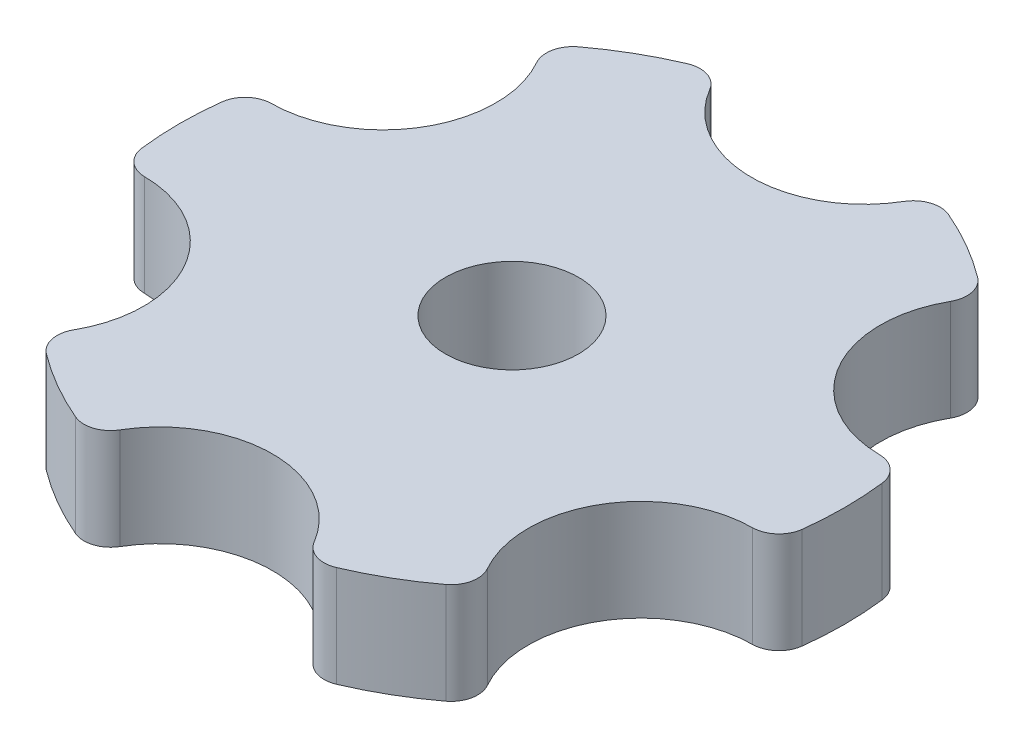
ISO-10303-21;
HEADER;
FILE_DESCRIPTION(('STEP AP214'),'2;1');
FILE_NAME('part.step','',(''),(''),'','','');
FILE_SCHEMA(('AUTOMOTIVE_DESIGN { 1 0 10303 214 1 1 1 1 }'));
ENDSEC;
DATA;
#1=APPLICATION_CONTEXT('core data for automotive mechanical design processes');
#2=APPLICATION_PROTOCOL_DEFINITION('international standard','automotive_design',2000,#1);
#3=PRODUCT_CONTEXT('',#1,'mechanical');
#4=PRODUCT('Part','Part','',(#3));
#5=PRODUCT_RELATED_PRODUCT_CATEGORY('part','',(#4));
#6=PRODUCT_DEFINITION_FORMATION('','',#4);
#7=PRODUCT_DEFINITION_CONTEXT('part definition',#1,'design');
#8=PRODUCT_DEFINITION('design','',#6,#7);
#9=PRODUCT_DEFINITION_SHAPE('','',#8);
#10=(LENGTH_UNIT() NAMED_UNIT(*) SI_UNIT(.MILLI.,.METRE.));
#11=(NAMED_UNIT(*) PLANE_ANGLE_UNIT() SI_UNIT($,.RADIAN.));
#12=(NAMED_UNIT(*) SI_UNIT($,.STERADIAN.) SOLID_ANGLE_UNIT());
#13=UNCERTAINTY_MEASURE_WITH_UNIT(LENGTH_MEASURE(1.E-05),#10,'distance_accuracy_value','');
#14=(GEOMETRIC_REPRESENTATION_CONTEXT(3) GLOBAL_UNCERTAINTY_ASSIGNED_CONTEXT((#13)) GLOBAL_UNIT_ASSIGNED_CONTEXT((#10,
#11,#12)) REPRESENTATION_CONTEXT('',''));
#15=CARTESIAN_POINT('',(0.,0.,0.));
#16=DIRECTION('',(0.,0.,1.));
#17=DIRECTION('',(1.,0.,0.));
#18=AXIS2_PLACEMENT_3D('',#15,#16,#17);
#19=CARTESIAN_POINT('',(0.,9.652,-16.809169409399));
#20=DIRECTION('',(0.,-1.,0.));
#21=DIRECTION('',(0.,0.,-1.));
#22=AXIS2_PLACEMENT_3D('',#19,#20,#21);
#23=PLANE('',#22);
#24=CARTESIAN_POINT('',(0.,9.652,0.));
#25=DIRECTION('',(0.,1.,0.));
#26=DIRECTION('',(0.,0.,-1.));
#27=AXIS2_PLACEMENT_3D('',#24,#25,#26);
#28=CIRCLE('',#27,31.75);
#29=CARTESIAN_POINT('',(12.4545474107137,9.652,29.2052520755135));
#30=VERTEX_POINT('',#29);
#31=CARTESIAN_POINT('',(19.065216515966,9.652,25.3885804880725));
#32=VERTEX_POINT('',#31);
#33=EDGE_CURVE('E445',#30,#32,#28,.T.);
#34=ORIENTED_EDGE('',*,*,#33,.T.);
#35=CARTESIAN_POINT('',(17.5399991946888,9.652,23.3574940490267));
#36=DIRECTION('',(0.,-1.,0.));
#37=DIRECTION('',(0.,0.,-1.));
#38=AXIS2_PLACEMENT_3D('',#35,#36,#37);
#39=CIRCLE('',#38,2.54);
#40=CARTESIAN_POINT('',(19.75071246417,9.652,22.1067555311343));
#41=VERTEX_POINT('',#40);
#42=EDGE_CURVE('E329',#32,#41,#39,.F.);
#43=ORIENTED_EDGE('',*,*,#42,.T.);
#44=CARTESIAN_POINT('',(29.1143354501117,9.652,16.809169409399));
#45=DIRECTION('',(0.,-1.,0.));
#46=DIRECTION('',(0.,0.,1.));
#47=AXIS2_PLACEMENT_3D('',#44,#45,#46);
#48=CIRCLE('',#47,10.7583388187981);
#49=CARTESIAN_POINT('',(29.0203681172995,9.652,6.05124097124599));
#50=VERTEX_POINT('',#49);
#51=EDGE_CURVE('E226',#41,#50,#48,.T.);
#52=ORIENTED_EDGE('',*,*,#51,.T.);
#53=CARTESIAN_POINT('',(28.9981828125453,9.652,3.51133786044571));
#54=DIRECTION('',(0.,-1.,0.));
#55=DIRECTION('',(0.,0.,-1.));
#56=AXIS2_PLACEMENT_3D('',#53,#54,#55);
#57=CIRCLE('',#56,2.54);
#58=CARTESIAN_POINT('',(31.5197639266797,9.652,3.81667158744099));
#59=VERTEX_POINT('',#58);
#60=EDGE_CURVE('E326',#50,#59,#57,.F.);
#61=ORIENTED_EDGE('',*,*,#60,.T.);
#62=CARTESIAN_POINT('',(0.,9.652,0.));
#63=DIRECTION('',(0.,1.,0.));
#64=DIRECTION('',(0.,0.,-1.));
#65=AXIS2_PLACEMENT_3D('',#62,#63,#64);
#66=CIRCLE('',#65,31.75);
#67=CARTESIAN_POINT('',(31.5197639266797,9.652,-3.81667158744092));
#68=VERTEX_POINT('',#67);
#69=EDGE_CURVE('E439',#59,#68,#66,.T.);
#70=ORIENTED_EDGE('',*,*,#69,.T.);
#71=CARTESIAN_POINT('',(28.9981828125454,9.652,-3.51133786044565));
#72=DIRECTION('',(0.,-1.,0.));
#73=DIRECTION('',(0.,0.,-1.));
#74=AXIS2_PLACEMENT_3D('',#71,#72,#73);
#75=CIRCLE('',#74,2.54);
#76=CARTESIAN_POINT('',(29.0203681172995,9.652,-6.05124097124593));
#77=VERTEX_POINT('',#76);
#78=EDGE_CURVE('E323',#68,#77,#75,.F.);
#79=ORIENTED_EDGE('',*,*,#78,.T.);
#80=CARTESIAN_POINT('',(29.1143354501117,9.652,-16.809169409399));
#81=DIRECTION('',(0.,-1.,0.));
#82=DIRECTION('',(0.,0.,1.));
#83=AXIS2_PLACEMENT_3D('',#80,#81,#82);
#84=CIRCLE('',#83,10.7583388187981);
#85=CARTESIAN_POINT('',(19.75071246417,9.652,-22.1067555311343));
#86=VERTEX_POINT('',#85);
#87=EDGE_CURVE('E435',#77,#86,#84,.T.);
#88=ORIENTED_EDGE('',*,*,#87,.T.);
#89=CARTESIAN_POINT('',(17.5399991946888,9.652,-23.3574940490267));
#90=DIRECTION('',(0.,-1.,0.));
#91=DIRECTION('',(0.,0.,-1.));
#92=AXIS2_PLACEMENT_3D('',#89,#90,#91);
#93=CIRCLE('',#92,2.54);
#94=CARTESIAN_POINT('',(19.0652165159661,9.652,-25.3885804880725));
#95=VERTEX_POINT('',#94);
#96=EDGE_CURVE('E320',#86,#95,#93,.F.);
#97=ORIENTED_EDGE('',*,*,#96,.T.);
#98=CARTESIAN_POINT('',(0.,9.652,0.));
#99=DIRECTION('',(0.,1.,0.));
#100=DIRECTION('',(0.,0.,-1.));
#101=AXIS2_PLACEMENT_3D('',#98,#99,#100);
#102=CIRCLE('',#101,31.75);
#103=CARTESIAN_POINT('',(12.4545474107137,9.652,-29.2052520755135));
#104=VERTEX_POINT('',#103);
#105=EDGE_CURVE('E432',#95,#104,#102,.T.);
#106=ORIENTED_EDGE('',*,*,#105,.T.);
#107=CARTESIAN_POINT('',(11.4581836178566,9.652,-26.8688319094724));
#108=DIRECTION('',(0.,-1.,0.));
#109=DIRECTION('',(0.,0.,-1.));
#110=AXIS2_PLACEMENT_3D('',#107,#108,#109);
#111=CIRCLE('',#110,2.54);
#112=CARTESIAN_POINT('',(9.26965565312948,9.652,-28.1579965023803));
#113=VERTEX_POINT('',#112);
#114=EDGE_CURVE('E65',#104,#113,#111,.F.);
#115=ORIENTED_EDGE('',*,*,#114,.T.);
#116=CARTESIAN_POINT('',(0.,9.652,-33.6183388187981));
#117=DIRECTION('',(0.,-1.,0.));
#118=DIRECTION('',(0.,0.,1.));
#119=AXIS2_PLACEMENT_3D('',#116,#117,#118);
#120=CIRCLE('',#119,10.7583388187981);
#121=CARTESIAN_POINT('',(-9.26965565312947,9.652,-28.1579965023803));
#122=VERTEX_POINT('',#121);
#123=EDGE_CURVE('E259',#113,#122,#120,.T.);
#124=ORIENTED_EDGE('',*,*,#123,.T.);
#125=CARTESIAN_POINT('',(-11.4581836178566,9.652,-26.8688319094724));
#126=DIRECTION('',(0.,-1.,0.));
#127=DIRECTION('',(0.,0.,-1.));
#128=AXIS2_PLACEMENT_3D('',#125,#126,#127);
#129=CIRCLE('',#128,2.54);
#130=CARTESIAN_POINT('',(-12.4545474107137,9.652,-29.2052520755135));
#131=VERTEX_POINT('',#130);
#132=EDGE_CURVE('E315',#122,#131,#129,.F.);
#133=ORIENTED_EDGE('',*,*,#132,.T.);
#134=CARTESIAN_POINT('',(0.,9.652,0.));
#135=DIRECTION('',(0.,1.,0.));
#136=DIRECTION('',(0.,0.,-1.));
#137=AXIS2_PLACEMENT_3D('',#134,#135,#136);
#138=CIRCLE('',#137,31.75);
#139=CARTESIAN_POINT('',(-19.0652165159657,9.652,-25.3885804880728));
#140=VERTEX_POINT('',#139);
#141=EDGE_CURVE('E257',#131,#140,#138,.T.);
#142=ORIENTED_EDGE('',*,*,#141,.T.);
#143=CARTESIAN_POINT('',(-17.5399991946884,9.652,-23.3574940490269));
#144=DIRECTION('',(0.,-1.,0.));
#145=DIRECTION('',(0.,0.,-1.));
#146=AXIS2_PLACEMENT_3D('',#143,#144,#145);
#147=CIRCLE('',#146,2.54);
#148=CARTESIAN_POINT('',(-19.7507124641696,9.652,-22.1067555311344));
#149=VERTEX_POINT('',#148);
#150=EDGE_CURVE('E312',#140,#149,#147,.F.);
#151=ORIENTED_EDGE('',*,*,#150,.T.);
#152=CARTESIAN_POINT('',(-29.114335450111,9.652,-16.8091694093984));
#153=DIRECTION('',(0.,-1.,0.));
#154=DIRECTION('',(0.,0.,1.));
#155=AXIS2_PLACEMENT_3D('',#152,#153,#154);
#156=CIRCLE('',#155,10.7583388187982);
#157=CARTESIAN_POINT('',(-29.0203681172991,9.652,-6.05124097124524));
#158=VERTEX_POINT('',#157);
#159=EDGE_CURVE('E463',#149,#158,#156,.T.);
#160=ORIENTED_EDGE('',*,*,#159,.T.);
#161=CARTESIAN_POINT('',(-28.9981828125451,9.652,-3.51133786044495));
#162=DIRECTION('',(0.,-1.,0.));
#163=DIRECTION('',(0.,0.,-1.));
#164=AXIS2_PLACEMENT_3D('',#161,#162,#163);
#165=CIRCLE('',#164,2.54);
#166=CARTESIAN_POINT('',(-31.5197639266794,9.652,-3.81667158744017));
#167=VERTEX_POINT('',#166);
#168=EDGE_CURVE('E309',#158,#167,#165,.F.);
#169=ORIENTED_EDGE('',*,*,#168,.T.);
#170=CARTESIAN_POINT('',(0.,9.652,0.));
#171=DIRECTION('',(0.,1.,0.));
#172=DIRECTION('',(0.,0.,-1.));
#173=AXIS2_PLACEMENT_3D('',#170,#171,#172);
#174=CIRCLE('',#173,31.7499999999996);
#175=CARTESIAN_POINT('',(-31.5197639266793,9.652,3.81667158744101));
#176=VERTEX_POINT('',#175);
#177=EDGE_CURVE('E459',#167,#176,#174,.T.);
#178=ORIENTED_EDGE('',*,*,#177,.T.);
#179=CARTESIAN_POINT('',(-28.998182812545,9.652,3.51133786044573));
#180=DIRECTION('',(0.,-1.,0.));
#181=DIRECTION('',(0.,0.,-1.));
#182=AXIS2_PLACEMENT_3D('',#179,#180,#181);
#183=CIRCLE('',#182,2.54);
#184=CARTESIAN_POINT('',(-29.0203681172991,9.652,6.05124097124601));
#185=VERTEX_POINT('',#184);
#186=EDGE_CURVE('E306',#176,#185,#183,.F.);
#187=ORIENTED_EDGE('',*,*,#186,.T.);
#188=CARTESIAN_POINT('',(-29.1143354501117,9.652,16.8091694093991));
#189=DIRECTION('',(0.,-1.,0.));
#190=DIRECTION('',(0.,0.,1.));
#191=AXIS2_PLACEMENT_3D('',#188,#189,#190);
#192=CIRCLE('',#191,10.7583388187981);
#193=CARTESIAN_POINT('',(-19.75071246417,9.652,22.1067555311343));
#194=VERTEX_POINT('',#193);
#195=EDGE_CURVE('E455',#185,#194,#192,.T.);
#196=ORIENTED_EDGE('',*,*,#195,.T.);
#197=CARTESIAN_POINT('',(-17.5399991946887,9.652,23.3574940490267));
#198=DIRECTION('',(0.,-1.,0.));
#199=DIRECTION('',(0.,0.,-1.));
#200=AXIS2_PLACEMENT_3D('',#197,#198,#199);
#201=CIRCLE('',#200,2.54);
#202=CARTESIAN_POINT('',(-19.065216515966,9.652,25.3885804880725));
#203=VERTEX_POINT('',#202);
#204=EDGE_CURVE('E303',#194,#203,#201,.F.);
#205=ORIENTED_EDGE('',*,*,#204,.T.);
#206=CARTESIAN_POINT('',(0.,9.652,0.));
#207=DIRECTION('',(0.,1.,0.));
#208=DIRECTION('',(0.,0.,-1.));
#209=AXIS2_PLACEMENT_3D('',#206,#207,#208);
#210=CIRCLE('',#209,31.75);
#211=CARTESIAN_POINT('',(-12.4545474107137,9.652,29.2052520755135));
#212=VERTEX_POINT('',#211);
#213=EDGE_CURVE('E451',#203,#212,#210,.T.);
#214=ORIENTED_EDGE('',*,*,#213,.T.);
#215=CARTESIAN_POINT('',(-11.4581836178566,9.652,26.8688319094724));
#216=DIRECTION('',(0.,-1.,0.));
#217=DIRECTION('',(0.,0.,-1.));
#218=AXIS2_PLACEMENT_3D('',#215,#216,#217);
#219=CIRCLE('',#218,2.54);
#220=CARTESIAN_POINT('',(-9.26965565312947,9.652,28.1579965023803));
#221=VERTEX_POINT('',#220);
#222=EDGE_CURVE('E297',#212,#221,#219,.F.);
#223=ORIENTED_EDGE('',*,*,#222,.T.);
#224=CARTESIAN_POINT('',(0.,9.652,33.6183388187981));
#225=DIRECTION('',(0.,-1.,0.));
#226=DIRECTION('',(0.,0.,1.));
#227=AXIS2_PLACEMENT_3D('',#224,#225,#226);
#228=CIRCLE('',#227,10.7583388187981);
#229=CARTESIAN_POINT('',(9.26965565312948,9.652,28.1579965023803));
#230=VERTEX_POINT('',#229);
#231=EDGE_CURVE('E403',#221,#230,#228,.T.);
#232=ORIENTED_EDGE('',*,*,#231,.T.);
#233=CARTESIAN_POINT('',(11.4581836178566,9.652,26.8688319094724));
#234=DIRECTION('',(0.,-1.,0.));
#235=DIRECTION('',(0.,0.,-1.));
#236=AXIS2_PLACEMENT_3D('',#233,#234,#235);
#237=CIRCLE('',#236,2.54);
#238=EDGE_CURVE('E300',#230,#30,#237,.F.);
#239=ORIENTED_EDGE('',*,*,#238,.T.);
#240=EDGE_LOOP('',(#34,#43,#52,#61,#70,#79,#88,#97,#106,#115,#124,#133,#142,#151,#160,#169,#178,
#187,#196,#205,#214,#223,#232,#239));
#241=FACE_BOUND('',#240,.T.);
#242=CARTESIAN_POINT('',(0.,9.652,0.));
#243=DIRECTION('',(0.,1.,0.));
#244=DIRECTION('',(0.,0.,1.));
#245=AXIS2_PLACEMENT_3D('',#242,#243,#244);
#246=CIRCLE('',#245,6.35);
#247=CARTESIAN_POINT('',(0.,9.652,6.35));
#248=VERTEX_POINT('',#247);
#249=EDGE_CURVE('E429',#248,#248,#246,.T.);
#250=ORIENTED_EDGE('',*,*,#249,.F.);
#251=EDGE_LOOP('',(#250));
#252=FACE_BOUND('',#251,.T.);
#253=ADVANCED_FACE('F42',(#241,#252),#23,.F.);
#254=CARTESIAN_POINT('',(0.,0.,-16.809169409399));
#255=DIRECTION('',(0.,-1.,0.));
#256=DIRECTION('',(0.,0.,-1.));
#257=AXIS2_PLACEMENT_3D('',#254,#255,#256);
#258=PLANE('',#257);
#259=CARTESIAN_POINT('',(29.1143354501117,0.,16.809169409399));
#260=DIRECTION('',(0.,-1.,0.));
#261=DIRECTION('',(0.,0.,1.));
#262=AXIS2_PLACEMENT_3D('',#259,#260,#261);
#263=CIRCLE('',#262,10.7583388187981);
#264=CARTESIAN_POINT('',(19.75071246417,0.,22.1067555311343));
#265=VERTEX_POINT('',#264);
#266=CARTESIAN_POINT('',(29.0203681172995,0.,6.05124097124599));
#267=VERTEX_POINT('',#266);
#268=EDGE_CURVE('E223',#265,#267,#263,.T.);
#269=ORIENTED_EDGE('',*,*,#268,.F.);
#270=CARTESIAN_POINT('',(17.5399991946888,0.,23.3574940490267));
#271=DIRECTION('',(0.,-1.,0.));
#272=DIRECTION('',(0.,0.,-1.));
#273=AXIS2_PLACEMENT_3D('',#270,#271,#272);
#274=CIRCLE('',#273,2.54);
#275=CARTESIAN_POINT('',(19.065216515966,0.,25.3885804880725));
#276=VERTEX_POINT('',#275);
#277=EDGE_CURVE('E205',#265,#276,#274,.T.);
#278=ORIENTED_EDGE('',*,*,#277,.T.);
#279=CARTESIAN_POINT('',(0.,0.,0.));
#280=DIRECTION('',(0.,1.,0.));
#281=DIRECTION('',(0.,0.,-1.));
#282=AXIS2_PLACEMENT_3D('',#279,#280,#281);
#283=CIRCLE('',#282,31.75);
#284=CARTESIAN_POINT('',(12.4545474107137,0.,29.2052520755135));
#285=VERTEX_POINT('',#284);
#286=EDGE_CURVE('E236',#285,#276,#283,.T.);
#287=ORIENTED_EDGE('',*,*,#286,.F.);
#288=CARTESIAN_POINT('',(11.4581836178566,0.,26.8688319094724));
#289=DIRECTION('',(0.,-1.,0.));
#290=DIRECTION('',(0.,0.,-1.));
#291=AXIS2_PLACEMENT_3D('',#288,#289,#290);
#292=CIRCLE('',#291,2.54);
#293=CARTESIAN_POINT('',(9.26965565312948,0.,28.1579965023803));
#294=VERTEX_POINT('',#293);
#295=EDGE_CURVE('E263',#285,#294,#292,.T.);
#296=ORIENTED_EDGE('',*,*,#295,.T.);
#297=CARTESIAN_POINT('',(0.,0.,33.6183388187981));
#298=DIRECTION('',(0.,-1.,0.));
#299=DIRECTION('',(0.,0.,1.));
#300=AXIS2_PLACEMENT_3D('',#297,#298,#299);
#301=CIRCLE('',#300,10.7583388187981);
#302=CARTESIAN_POINT('',(-9.26965565312947,0.,28.1579965023803));
#303=VERTEX_POINT('',#302);
#304=EDGE_CURVE('E243',#303,#294,#301,.T.);
#305=ORIENTED_EDGE('',*,*,#304,.F.);
#306=CARTESIAN_POINT('',(-11.4581836178566,0.,26.8688319094724));
#307=DIRECTION('',(0.,-1.,0.));
#308=DIRECTION('',(0.,0.,-1.));
#309=AXIS2_PLACEMENT_3D('',#306,#307,#308);
#310=CIRCLE('',#309,2.54);
#311=CARTESIAN_POINT('',(-12.4545474107137,0.,29.2052520755135));
#312=VERTEX_POINT('',#311);
#313=EDGE_CURVE('E228',#303,#312,#310,.T.);
#314=ORIENTED_EDGE('',*,*,#313,.T.);
#315=CARTESIAN_POINT('',(0.,0.,0.));
#316=DIRECTION('',(0.,1.,0.));
#317=DIRECTION('',(0.,0.,-1.));
#318=AXIS2_PLACEMENT_3D('',#315,#316,#317);
#319=CIRCLE('',#318,31.75);
#320=CARTESIAN_POINT('',(-19.065216515966,0.,25.3885804880725));
#321=VERTEX_POINT('',#320);
#322=EDGE_CURVE('E409',#321,#312,#319,.T.);
#323=ORIENTED_EDGE('',*,*,#322,.F.);
#324=CARTESIAN_POINT('',(-17.5399991946887,0.,23.3574940490267));
#325=DIRECTION('',(0.,-1.,0.));
#326=DIRECTION('',(0.,0.,-1.));
#327=AXIS2_PLACEMENT_3D('',#324,#325,#326);
#328=CIRCLE('',#327,2.54);
#329=CARTESIAN_POINT('',(-19.75071246417,0.,22.1067555311343));
#330=VERTEX_POINT('',#329);
#331=EDGE_CURVE('E266',#321,#330,#328,.T.);
#332=ORIENTED_EDGE('',*,*,#331,.T.);
#333=CARTESIAN_POINT('',(-29.1143354501117,0.,16.8091694093991));
#334=DIRECTION('',(0.,-1.,0.));
#335=DIRECTION('',(0.,0.,1.));
#336=AXIS2_PLACEMENT_3D('',#333,#334,#335);
#337=CIRCLE('',#336,10.7583388187981);
#338=CARTESIAN_POINT('',(-29.0203681172991,0.,6.05124097124601));
#339=VERTEX_POINT('',#338);
#340=EDGE_CURVE('E411',#339,#330,#337,.T.);
#341=ORIENTED_EDGE('',*,*,#340,.F.);
#342=CARTESIAN_POINT('',(-28.998182812545,0.,3.51133786044573));
#343=DIRECTION('',(0.,-1.,0.));
#344=DIRECTION('',(0.,0.,-1.));
#345=AXIS2_PLACEMENT_3D('',#342,#343,#344);
#346=CIRCLE('',#345,2.54);
#347=CARTESIAN_POINT('',(-31.5197639266793,0.,3.81667158744101));
#348=VERTEX_POINT('',#347);
#349=EDGE_CURVE('E269',#339,#348,#346,.T.);
#350=ORIENTED_EDGE('',*,*,#349,.T.);
#351=CARTESIAN_POINT('',(0.,0.,0.));
#352=DIRECTION('',(0.,1.,0.));
#353=DIRECTION('',(0.,0.,-1.));
#354=AXIS2_PLACEMENT_3D('',#351,#352,#353);
#355=CIRCLE('',#354,31.7499999999996);
#356=CARTESIAN_POINT('',(-31.5197639266794,0.,-3.81667158744017));
#357=VERTEX_POINT('',#356);
#358=EDGE_CURVE('E417',#357,#348,#355,.T.);
#359=ORIENTED_EDGE('',*,*,#358,.F.);
#360=CARTESIAN_POINT('',(-28.9981828125451,0.,-3.51133786044495));
#361=DIRECTION('',(0.,-1.,0.));
#362=DIRECTION('',(0.,0.,-1.));
#363=AXIS2_PLACEMENT_3D('',#360,#361,#362);
#364=CIRCLE('',#363,2.54);
#365=CARTESIAN_POINT('',(-29.0203681172991,0.,-6.05124097124524));
#366=VERTEX_POINT('',#365);
#367=EDGE_CURVE('E272',#357,#366,#364,.T.);
#368=ORIENTED_EDGE('',*,*,#367,.T.);
#369=CARTESIAN_POINT('',(-29.114335450111,0.,-16.8091694093984));
#370=DIRECTION('',(0.,-1.,0.));
#371=DIRECTION('',(0.,0.,1.));
#372=AXIS2_PLACEMENT_3D('',#369,#370,#371);
#373=CIRCLE('',#372,10.7583388187982);
#374=CARTESIAN_POINT('',(-19.7507124641696,0.,-22.1067555311344));
#375=VERTEX_POINT('',#374);
#376=EDGE_CURVE('E421',#375,#366,#373,.T.);
#377=ORIENTED_EDGE('',*,*,#376,.F.);
#378=CARTESIAN_POINT('',(-17.5399991946884,0.,-23.3574940490269));
#379=DIRECTION('',(0.,-1.,0.));
#380=DIRECTION('',(0.,0.,-1.));
#381=AXIS2_PLACEMENT_3D('',#378,#379,#380);
#382=CIRCLE('',#381,2.54);
#383=CARTESIAN_POINT('',(-19.0652165159657,0.,-25.3885804880728));
#384=VERTEX_POINT('',#383);
#385=EDGE_CURVE('E275',#375,#384,#382,.T.);
#386=ORIENTED_EDGE('',*,*,#385,.T.);
#387=CARTESIAN_POINT('',(0.,0.,0.));
#388=DIRECTION('',(0.,1.,0.));
#389=DIRECTION('',(0.,0.,-1.));
#390=AXIS2_PLACEMENT_3D('',#387,#388,#389);
#391=CIRCLE('',#390,31.75);
#392=CARTESIAN_POINT('',(-12.4545474107137,0.,-29.2052520755135));
#393=VERTEX_POINT('',#392);
#394=EDGE_CURVE('E425',#393,#384,#391,.T.);
#395=ORIENTED_EDGE('',*,*,#394,.F.);
#396=CARTESIAN_POINT('',(-11.4581836178566,0.,-26.8688319094724));
#397=DIRECTION('',(0.,-1.,0.));
#398=DIRECTION('',(0.,0.,-1.));
#399=AXIS2_PLACEMENT_3D('',#396,#397,#398);
#400=CIRCLE('',#399,2.54);
#401=CARTESIAN_POINT('',(-9.26965565312947,0.,-28.1579965023803));
#402=VERTEX_POINT('',#401);
#403=EDGE_CURVE('E278',#393,#402,#400,.T.);
#404=ORIENTED_EDGE('',*,*,#403,.T.);
#405=CARTESIAN_POINT('',(0.,0.,-33.6183388187981));
#406=DIRECTION('',(0.,-1.,0.));
#407=DIRECTION('',(0.,0.,1.));
#408=AXIS2_PLACEMENT_3D('',#405,#406,#407);
#409=CIRCLE('',#408,10.7583388187981);
#410=CARTESIAN_POINT('',(9.26965565312948,0.,-28.1579965023803));
#411=VERTEX_POINT('',#410);
#412=EDGE_CURVE('E254',#411,#402,#409,.T.);
#413=ORIENTED_EDGE('',*,*,#412,.F.);
#414=CARTESIAN_POINT('',(11.4581836178566,0.,-26.8688319094724));
#415=DIRECTION('',(0.,-1.,0.));
#416=DIRECTION('',(0.,0.,-1.));
#417=AXIS2_PLACEMENT_3D('',#414,#415,#416);
#418=CIRCLE('',#417,2.54);
#419=CARTESIAN_POINT('',(12.4545474107137,0.,-29.2052520755135));
#420=VERTEX_POINT('',#419);
#421=EDGE_CURVE('E281',#411,#420,#418,.T.);
#422=ORIENTED_EDGE('',*,*,#421,.T.);
#423=CARTESIAN_POINT('',(0.,0.,0.));
#424=DIRECTION('',(0.,1.,0.));
#425=DIRECTION('',(0.,0.,-1.));
#426=AXIS2_PLACEMENT_3D('',#423,#424,#425);
#427=CIRCLE('',#426,31.75);
#428=CARTESIAN_POINT('',(19.0652165159661,0.,-25.3885804880725));
#429=VERTEX_POINT('',#428);
#430=EDGE_CURVE('E250',#429,#420,#427,.T.);
#431=ORIENTED_EDGE('',*,*,#430,.F.);
#432=CARTESIAN_POINT('',(17.5399991946888,0.,-23.3574940490267));
#433=DIRECTION('',(0.,-1.,0.));
#434=DIRECTION('',(0.,0.,-1.));
#435=AXIS2_PLACEMENT_3D('',#432,#433,#434);
#436=CIRCLE('',#435,2.54);
#437=CARTESIAN_POINT('',(19.75071246417,0.,-22.1067555311343));
#438=VERTEX_POINT('',#437);
#439=EDGE_CURVE('E284',#429,#438,#436,.T.);
#440=ORIENTED_EDGE('',*,*,#439,.T.);
#441=CARTESIAN_POINT('',(29.1143354501117,0.,-16.809169409399));
#442=DIRECTION('',(0.,-1.,0.));
#443=DIRECTION('',(0.,0.,1.));
#444=AXIS2_PLACEMENT_3D('',#441,#442,#443);
#445=CIRCLE('',#444,10.7583388187981);
#446=CARTESIAN_POINT('',(29.0203681172995,0.,-6.05124097124593));
#447=VERTEX_POINT('',#446);
#448=EDGE_CURVE('E241',#447,#438,#445,.T.);
#449=ORIENTED_EDGE('',*,*,#448,.F.);
#450=CARTESIAN_POINT('',(28.9981828125454,0.,-3.51133786044565));
#451=DIRECTION('',(0.,-1.,0.));
#452=DIRECTION('',(0.,0.,-1.));
#453=AXIS2_PLACEMENT_3D('',#450,#451,#452);
#454=CIRCLE('',#453,2.54);
#455=CARTESIAN_POINT('',(31.5197639266797,0.,-3.81667158744092));
#456=VERTEX_POINT('',#455);
#457=EDGE_CURVE('E287',#447,#456,#454,.T.);
#458=ORIENTED_EDGE('',*,*,#457,.T.);
#459=CARTESIAN_POINT('',(0.,0.,0.));
#460=DIRECTION('',(0.,1.,0.));
#461=DIRECTION('',(0.,0.,-1.));
#462=AXIS2_PLACEMENT_3D('',#459,#460,#461);
#463=CIRCLE('',#462,31.75);
#464=CARTESIAN_POINT('',(31.5197639266797,0.,3.81667158744099));
#465=VERTEX_POINT('',#464);
#466=EDGE_CURVE('E235',#465,#456,#463,.T.);
#467=ORIENTED_EDGE('',*,*,#466,.F.);
#468=CARTESIAN_POINT('',(28.9981828125453,0.,3.51133786044571));
#469=DIRECTION('',(0.,-1.,0.));
#470=DIRECTION('',(0.,0.,-1.));
#471=AXIS2_PLACEMENT_3D('',#468,#469,#470);
#472=CIRCLE('',#471,2.54);
#473=EDGE_CURVE('E217',#465,#267,#472,.T.);
#474=ORIENTED_EDGE('',*,*,#473,.T.);
#475=EDGE_LOOP('',(#269,#278,#287,#296,#305,#314,#323,#332,#341,#350,#359,#368,#377,#386,#395,
#404,#413,#422,#431,#440,#449,#458,#467,#474));
#476=FACE_BOUND('',#475,.T.);
#477=CARTESIAN_POINT('',(0.,0.,0.));
#478=DIRECTION('',(0.,1.,0.));
#479=DIRECTION('',(0.,0.,1.));
#480=AXIS2_PLACEMENT_3D('',#477,#478,#479);
#481=CIRCLE('',#480,6.35);
#482=CARTESIAN_POINT('',(0.,0.,6.35));
#483=VERTEX_POINT('',#482);
#484=EDGE_CURVE('E470',#483,#483,#481,.T.);
#485=ORIENTED_EDGE('',*,*,#484,.T.);
#486=EDGE_LOOP('',(#485));
#487=FACE_BOUND('',#486,.T.);
#488=ADVANCED_FACE('F231',(#476,#487),#258,.T.);
#489=CARTESIAN_POINT('',(0.,9.652,0.));
#490=DIRECTION('',(0.,-1.,0.));
#491=DIRECTION('',(0.,0.,-1.));
#492=AXIS2_PLACEMENT_3D('',#489,#490,#491);
#493=CYLINDRICAL_SURFACE('',#492,31.75);
#494=ORIENTED_EDGE('',*,*,#141,.F.);
#495=DIRECTION('',(0.,-1.,0.));
#496=VECTOR('',#495,1.);
#497=CARTESIAN_POINT('',(-12.4545474107137,9.652,-29.2052520755135));
#498=LINE('',#497,#496);
#499=EDGE_CURVE('E362',#131,#393,#498,.T.);
#500=ORIENTED_EDGE('',*,*,#499,.T.);
#501=ORIENTED_EDGE('',*,*,#394,.T.);
#502=DIRECTION('',(0.,-1.,0.));
#503=VECTOR('',#502,1.);
#504=CARTESIAN_POINT('',(-19.0652165159657,9.652,-25.3885804880728));
#505=LINE('',#504,#503);
#506=EDGE_CURVE('E359',#384,#140,#505,.F.);
#507=ORIENTED_EDGE('',*,*,#506,.T.);
#508=EDGE_LOOP('',(#494,#500,#501,#507));
#509=FACE_BOUND('',#508,.T.);
#510=ADVANCED_FACE('F486',(#509),#493,.T.);
#511=CARTESIAN_POINT('',(-29.114335450111,9.652,-16.8091694093984));
#512=DIRECTION('',(0.,-1.,0.));
#513=DIRECTION('',(0.,0.,-1.));
#514=AXIS2_PLACEMENT_3D('',#511,#512,#513);
#515=CYLINDRICAL_SURFACE('',#514,10.7583388187982);
#516=ORIENTED_EDGE('',*,*,#159,.F.);
#517=DIRECTION('',(0.,-1.,0.));
#518=VECTOR('',#517,1.);
#519=CARTESIAN_POINT('',(-19.7507124641696,9.652,-22.1067555311344));
#520=LINE('',#519,#518);
#521=EDGE_CURVE('E369',#149,#375,#520,.T.);
#522=ORIENTED_EDGE('',*,*,#521,.T.);
#523=ORIENTED_EDGE('',*,*,#376,.T.);
#524=DIRECTION('',(0.,-1.,0.));
#525=VECTOR('',#524,1.);
#526=CARTESIAN_POINT('',(-29.0203681172991,9.652,-6.05124097124524));
#527=LINE('',#526,#525);
#528=EDGE_CURVE('E366',#366,#158,#527,.F.);
#529=ORIENTED_EDGE('',*,*,#528,.T.);
#530=EDGE_LOOP('',(#516,#522,#523,#529));
#531=FACE_BOUND('',#530,.T.);
#532=ADVANCED_FACE('F524',(#531),#515,.F.);
#533=CARTESIAN_POINT('',(0.,9.652,0.));
#534=DIRECTION('',(0.,-1.,0.));
#535=DIRECTION('',(0.,0.,-1.));
#536=AXIS2_PLACEMENT_3D('',#533,#534,#535);
#537=CYLINDRICAL_SURFACE('',#536,31.7499999999996);
#538=ORIENTED_EDGE('',*,*,#177,.F.);
#539=DIRECTION('',(0.,-1.,0.));
#540=VECTOR('',#539,1.);
#541=CARTESIAN_POINT('',(-31.5197639266794,9.652,-3.81667158744017));
#542=LINE('',#541,#540);
#543=EDGE_CURVE('E376',#167,#357,#542,.T.);
#544=ORIENTED_EDGE('',*,*,#543,.T.);
#545=ORIENTED_EDGE('',*,*,#358,.T.);
#546=DIRECTION('',(0.,-1.,0.));
#547=VECTOR('',#546,1.);
#548=CARTESIAN_POINT('',(-31.5197639266793,9.652,3.81667158744101));
#549=LINE('',#548,#547);
#550=EDGE_CURVE('E373',#348,#176,#549,.F.);
#551=ORIENTED_EDGE('',*,*,#550,.T.);
#552=EDGE_LOOP('',(#538,#544,#545,#551));
#553=FACE_BOUND('',#552,.T.);
#554=ADVANCED_FACE('F520',(#553),#537,.T.);
#555=CARTESIAN_POINT('',(-29.1143354501117,9.652,16.8091694093991));
#556=DIRECTION('',(0.,-1.,0.));
#557=DIRECTION('',(0.,0.,-1.));
#558=AXIS2_PLACEMENT_3D('',#555,#556,#557);
#559=CYLINDRICAL_SURFACE('',#558,10.7583388187981);
#560=ORIENTED_EDGE('',*,*,#195,.F.);
#561=DIRECTION('',(0.,-1.,0.));
#562=VECTOR('',#561,1.);
#563=CARTESIAN_POINT('',(-29.0203681172991,9.652,6.05124097124601));
#564=LINE('',#563,#562);
#565=EDGE_CURVE('E383',#185,#339,#564,.T.);
#566=ORIENTED_EDGE('',*,*,#565,.T.);
#567=ORIENTED_EDGE('',*,*,#340,.T.);
#568=DIRECTION('',(0.,-1.,0.));
#569=VECTOR('',#568,1.);
#570=CARTESIAN_POINT('',(-19.75071246417,9.652,22.1067555311343));
#571=LINE('',#570,#569);
#572=EDGE_CURVE('E380',#330,#194,#571,.F.);
#573=ORIENTED_EDGE('',*,*,#572,.T.);
#574=EDGE_LOOP('',(#560,#566,#567,#573));
#575=FACE_BOUND('',#574,.T.);
#576=ADVANCED_FACE('F516',(#575),#559,.F.);
#577=CARTESIAN_POINT('',(0.,9.652,0.));
#578=DIRECTION('',(0.,-1.,0.));
#579=DIRECTION('',(0.,0.,-1.));
#580=AXIS2_PLACEMENT_3D('',#577,#578,#579);
#581=CYLINDRICAL_SURFACE('',#580,31.75);
#582=ORIENTED_EDGE('',*,*,#213,.F.);
#583=DIRECTION('',(0.,-1.,0.));
#584=VECTOR('',#583,1.);
#585=CARTESIAN_POINT('',(-19.065216515966,9.652,25.3885804880725));
#586=LINE('',#585,#584);
#587=EDGE_CURVE('E390',#203,#321,#586,.T.);
#588=ORIENTED_EDGE('',*,*,#587,.T.);
#589=ORIENTED_EDGE('',*,*,#322,.T.);
#590=DIRECTION('',(0.,-1.,0.));
#591=VECTOR('',#590,1.);
#592=CARTESIAN_POINT('',(-12.4545474107137,9.652,29.2052520755135));
#593=LINE('',#592,#591);
#594=EDGE_CURVE('E387',#312,#212,#593,.F.);
#595=ORIENTED_EDGE('',*,*,#594,.T.);
#596=EDGE_LOOP('',(#582,#588,#589,#595));
#597=FACE_BOUND('',#596,.T.);
#598=ADVANCED_FACE('F513',(#597),#581,.T.);
#599=CARTESIAN_POINT('',(0.,9.652,33.6183388187981));
#600=DIRECTION('',(0.,-1.,0.));
#601=DIRECTION('',(0.,0.,-1.));
#602=AXIS2_PLACEMENT_3D('',#599,#600,#601);
#603=CYLINDRICAL_SURFACE('',#602,10.7583388187981);
#604=ORIENTED_EDGE('',*,*,#304,.T.);
#605=DIRECTION('',(0.,-1.,0.));
#606=VECTOR('',#605,1.);
#607=CARTESIAN_POINT('',(9.26965565312948,9.652,28.1579965023803));
#608=LINE('',#607,#606);
#609=EDGE_CURVE('E11',#294,#230,#608,.F.);
#610=ORIENTED_EDGE('',*,*,#609,.T.);
#611=ORIENTED_EDGE('',*,*,#231,.F.);
#612=DIRECTION('',(0.,-1.,0.));
#613=VECTOR('',#612,1.);
#614=CARTESIAN_POINT('',(-9.26965565312947,9.652,28.1579965023803));
#615=LINE('',#614,#613);
#616=EDGE_CURVE('E51',#221,#303,#615,.T.);
#617=ORIENTED_EDGE('',*,*,#616,.T.);
#618=EDGE_LOOP('',(#604,#610,#611,#617));
#619=FACE_BOUND('',#618,.T.);
#620=ADVANCED_FACE('F400',(#619),#603,.F.);
#621=CARTESIAN_POINT('',(0.,9.652,0.));
#622=DIRECTION('',(0.,-1.,0.));
#623=DIRECTION('',(0.,0.,-1.));
#624=AXIS2_PLACEMENT_3D('',#621,#622,#623);
#625=CYLINDRICAL_SURFACE('',#624,31.75);
#626=ORIENTED_EDGE('',*,*,#286,.T.);
#627=DIRECTION('',(0.,-1.,0.));
#628=VECTOR('',#627,1.);
#629=CARTESIAN_POINT('',(19.0652165159661,9.652,25.3885804880725));
#630=LINE('',#629,#628);
#631=EDGE_CURVE('E210',#276,#32,#630,.F.);
#632=ORIENTED_EDGE('',*,*,#631,.T.);
#633=ORIENTED_EDGE('',*,*,#33,.F.);
#634=DIRECTION('',(0.,-1.,0.));
#635=VECTOR('',#634,1.);
#636=CARTESIAN_POINT('',(12.4545474107137,9.652,29.2052520755135));
#637=LINE('',#636,#635);
#638=EDGE_CURVE('E216',#30,#285,#637,.T.);
#639=ORIENTED_EDGE('',*,*,#638,.T.);
#640=EDGE_LOOP('',(#626,#632,#633,#639));
#641=FACE_BOUND('',#640,.T.);
#642=ADVANCED_FACE('F507',(#641),#625,.T.);
#643=CARTESIAN_POINT('',(29.1143354501117,9.652,16.809169409399));
#644=DIRECTION('',(0.,-1.,0.));
#645=DIRECTION('',(0.,0.,-1.));
#646=AXIS2_PLACEMENT_3D('',#643,#644,#645);
#647=CYLINDRICAL_SURFACE('',#646,10.7583388187981);
#648=ORIENTED_EDGE('',*,*,#51,.F.);
#649=DIRECTION('',(0.,-1.,0.));
#650=VECTOR('',#649,1.);
#651=CARTESIAN_POINT('',(19.75071246417,9.652,22.1067555311343));
#652=LINE('',#651,#650);
#653=EDGE_CURVE('E209',#41,#265,#652,.T.);
#654=ORIENTED_EDGE('',*,*,#653,.T.);
#655=ORIENTED_EDGE('',*,*,#268,.T.);
#656=DIRECTION('',(0.,-1.,0.));
#657=VECTOR('',#656,1.);
#658=CARTESIAN_POINT('',(29.0203681172995,9.652,6.05124097124599));
#659=LINE('',#658,#657);
#660=EDGE_CURVE('E229',#267,#50,#659,.F.);
#661=ORIENTED_EDGE('',*,*,#660,.T.);
#662=EDGE_LOOP('',(#648,#654,#655,#661));
#663=FACE_BOUND('',#662,.T.);
#664=ADVANCED_FACE('F222',(#663),#647,.F.);
#665=CARTESIAN_POINT('',(0.,9.652,0.));
#666=DIRECTION('',(0.,-1.,0.));
#667=DIRECTION('',(0.,0.,-1.));
#668=AXIS2_PLACEMENT_3D('',#665,#666,#667);
#669=CYLINDRICAL_SURFACE('',#668,31.75);
#670=ORIENTED_EDGE('',*,*,#69,.F.);
#671=DIRECTION('',(0.,-1.,0.));
#672=VECTOR('',#671,1.);
#673=CARTESIAN_POINT('',(31.5197639266797,9.652,3.81667158744099));
#674=LINE('',#673,#672);
#675=EDGE_CURVE('E335',#59,#465,#674,.T.);
#676=ORIENTED_EDGE('',*,*,#675,.T.);
#677=ORIENTED_EDGE('',*,*,#466,.T.);
#678=DIRECTION('',(0.,-1.,0.));
#679=VECTOR('',#678,1.);
#680=CARTESIAN_POINT('',(31.5197639266797,9.652,-3.81667158744092));
#681=LINE('',#680,#679);
#682=EDGE_CURVE('E332',#456,#68,#681,.F.);
#683=ORIENTED_EDGE('',*,*,#682,.T.);
#684=EDGE_LOOP('',(#670,#676,#677,#683));
#685=FACE_BOUND('',#684,.T.);
#686=ADVANCED_FACE('F500',(#685),#669,.T.);
#687=CARTESIAN_POINT('',(29.1143354501117,9.652,-16.809169409399));
#688=DIRECTION('',(0.,-1.,0.));
#689=DIRECTION('',(0.,0.,-1.));
#690=AXIS2_PLACEMENT_3D('',#687,#688,#689);
#691=CYLINDRICAL_SURFACE('',#690,10.7583388187981);
#692=ORIENTED_EDGE('',*,*,#87,.F.);
#693=DIRECTION('',(0.,-1.,0.));
#694=VECTOR('',#693,1.);
#695=CARTESIAN_POINT('',(29.0203681172995,9.652,-6.05124097124593));
#696=LINE('',#695,#694);
#697=EDGE_CURVE('E342',#77,#447,#696,.T.);
#698=ORIENTED_EDGE('',*,*,#697,.T.);
#699=ORIENTED_EDGE('',*,*,#448,.T.);
#700=DIRECTION('',(0.,-1.,0.));
#701=VECTOR('',#700,1.);
#702=CARTESIAN_POINT('',(19.75071246417,9.652,-22.1067555311343));
#703=LINE('',#702,#701);
#704=EDGE_CURVE('E339',#438,#86,#703,.F.);
#705=ORIENTED_EDGE('',*,*,#704,.T.);
#706=EDGE_LOOP('',(#692,#698,#699,#705));
#707=FACE_BOUND('',#706,.T.);
#708=ADVANCED_FACE('F496',(#707),#691,.F.);
#709=CARTESIAN_POINT('',(0.,9.652,0.));
#710=DIRECTION('',(0.,-1.,0.));
#711=DIRECTION('',(0.,0.,-1.));
#712=AXIS2_PLACEMENT_3D('',#709,#710,#711);
#713=CYLINDRICAL_SURFACE('',#712,31.75);
#714=ORIENTED_EDGE('',*,*,#105,.F.);
#715=DIRECTION('',(0.,-1.,0.));
#716=VECTOR('',#715,1.);
#717=CARTESIAN_POINT('',(19.0652165159661,9.652,-25.3885804880725));
#718=LINE('',#717,#716);
#719=EDGE_CURVE('E349',#95,#429,#718,.T.);
#720=ORIENTED_EDGE('',*,*,#719,.T.);
#721=ORIENTED_EDGE('',*,*,#430,.T.);
#722=DIRECTION('',(0.,-1.,0.));
#723=VECTOR('',#722,1.);
#724=CARTESIAN_POINT('',(12.4545474107137,9.652,-29.2052520755135));
#725=LINE('',#724,#723);
#726=EDGE_CURVE('E346',#420,#104,#725,.F.);
#727=ORIENTED_EDGE('',*,*,#726,.T.);
#728=EDGE_LOOP('',(#714,#720,#721,#727));
#729=FACE_BOUND('',#728,.T.);
#730=ADVANCED_FACE('F493',(#729),#713,.T.);
#731=CARTESIAN_POINT('',(0.,9.652,-33.6183388187981));
#732=DIRECTION('',(0.,-1.,0.));
#733=DIRECTION('',(0.,0.,-1.));
#734=AXIS2_PLACEMENT_3D('',#731,#732,#733);
#735=CYLINDRICAL_SURFACE('',#734,10.7583388187981);
#736=ORIENTED_EDGE('',*,*,#123,.F.);
#737=DIRECTION('',(0.,-1.,0.));
#738=VECTOR('',#737,1.);
#739=CARTESIAN_POINT('',(9.26965565312948,9.652,-28.1579965023803));
#740=LINE('',#739,#738);
#741=EDGE_CURVE('E355',#113,#411,#740,.T.);
#742=ORIENTED_EDGE('',*,*,#741,.T.);
#743=ORIENTED_EDGE('',*,*,#412,.T.);
#744=DIRECTION('',(0.,-1.,0.));
#745=VECTOR('',#744,1.);
#746=CARTESIAN_POINT('',(-9.26965565312947,9.652,-28.1579965023803));
#747=LINE('',#746,#745);
#748=EDGE_CURVE('E58',#402,#122,#747,.F.);
#749=ORIENTED_EDGE('',*,*,#748,.T.);
#750=EDGE_LOOP('',(#736,#742,#743,#749));
#751=FACE_BOUND('',#750,.T.);
#752=ADVANCED_FACE('F490',(#751),#735,.F.);
#753=CARTESIAN_POINT('',(0.,9.652,0.));
#754=DIRECTION('',(0.,-1.,0.));
#755=DIRECTION('',(0.,0.,-1.));
#756=AXIS2_PLACEMENT_3D('',#753,#754,#755);
#757=CYLINDRICAL_SURFACE('',#756,6.35);
#758=ORIENTED_EDGE('',*,*,#249,.T.);
#759=EDGE_LOOP('',(#758));
#760=FACE_BOUND('',#759,.T.);
#761=ORIENTED_EDGE('',*,*,#484,.F.);
#762=EDGE_LOOP('',(#761));
#763=FACE_BOUND('',#762,.T.);
#764=ADVANCED_FACE('F478',(#760,#763),#757,.F.);
#765=CARTESIAN_POINT('',(17.5399991946888,9.652,23.3574940490267));
#766=DIRECTION('',(0.,1.,0.));
#767=DIRECTION('',(0.,0.,1.));
#768=AXIS2_PLACEMENT_3D('',#765,#766,#767);
#769=CYLINDRICAL_SURFACE('',#768,2.54);
#770=ORIENTED_EDGE('',*,*,#42,.F.);
#771=ORIENTED_EDGE('',*,*,#631,.F.);
#772=ORIENTED_EDGE('',*,*,#277,.F.);
#773=ORIENTED_EDGE('',*,*,#653,.F.);
#774=EDGE_LOOP('',(#770,#771,#772,#773));
#775=FACE_BOUND('',#774,.T.);
#776=ADVANCED_FACE('F208',(#775),#769,.T.);
#777=CARTESIAN_POINT('',(28.9981828125453,9.652,3.51133786044571));
#778=DIRECTION('',(0.,1.,0.));
#779=DIRECTION('',(0.,0.,1.));
#780=AXIS2_PLACEMENT_3D('',#777,#778,#779);
#781=CYLINDRICAL_SURFACE('',#780,2.54);
#782=ORIENTED_EDGE('',*,*,#60,.F.);
#783=ORIENTED_EDGE('',*,*,#660,.F.);
#784=ORIENTED_EDGE('',*,*,#473,.F.);
#785=ORIENTED_EDGE('',*,*,#675,.F.);
#786=EDGE_LOOP('',(#782,#783,#784,#785));
#787=FACE_BOUND('',#786,.T.);
#788=ADVANCED_FACE('F534',(#787),#781,.T.);
#789=CARTESIAN_POINT('',(28.9981828125454,9.652,-3.51133786044565));
#790=DIRECTION('',(0.,1.,0.));
#791=DIRECTION('',(0.,0.,1.));
#792=AXIS2_PLACEMENT_3D('',#789,#790,#791);
#793=CYLINDRICAL_SURFACE('',#792,2.54);
#794=ORIENTED_EDGE('',*,*,#78,.F.);
#795=ORIENTED_EDGE('',*,*,#682,.F.);
#796=ORIENTED_EDGE('',*,*,#457,.F.);
#797=ORIENTED_EDGE('',*,*,#697,.F.);
#798=EDGE_LOOP('',(#794,#795,#796,#797));
#799=FACE_BOUND('',#798,.T.);
#800=ADVANCED_FACE('F537',(#799),#793,.T.);
#801=CARTESIAN_POINT('',(17.5399991946888,9.652,-23.3574940490267));
#802=DIRECTION('',(0.,1.,0.));
#803=DIRECTION('',(0.,0.,1.));
#804=AXIS2_PLACEMENT_3D('',#801,#802,#803);
#805=CYLINDRICAL_SURFACE('',#804,2.54);
#806=ORIENTED_EDGE('',*,*,#96,.F.);
#807=ORIENTED_EDGE('',*,*,#704,.F.);
#808=ORIENTED_EDGE('',*,*,#439,.F.);
#809=ORIENTED_EDGE('',*,*,#719,.F.);
#810=EDGE_LOOP('',(#806,#807,#808,#809));
#811=FACE_BOUND('',#810,.T.);
#812=ADVANCED_FACE('F541',(#811),#805,.T.);
#813=CARTESIAN_POINT('',(11.4581836178566,9.652,-26.8688319094724));
#814=DIRECTION('',(0.,1.,0.));
#815=DIRECTION('',(0.,0.,1.));
#816=AXIS2_PLACEMENT_3D('',#813,#814,#815);
#817=CYLINDRICAL_SURFACE('',#816,2.54);
#818=ORIENTED_EDGE('',*,*,#114,.F.);
#819=ORIENTED_EDGE('',*,*,#726,.F.);
#820=ORIENTED_EDGE('',*,*,#421,.F.);
#821=ORIENTED_EDGE('',*,*,#741,.F.);
#822=EDGE_LOOP('',(#818,#819,#820,#821));
#823=FACE_BOUND('',#822,.T.);
#824=ADVANCED_FACE('F545',(#823),#817,.T.);
#825=CARTESIAN_POINT('',(-11.4581836178566,9.652,-26.8688319094724));
#826=DIRECTION('',(0.,1.,0.));
#827=DIRECTION('',(0.,0.,1.));
#828=AXIS2_PLACEMENT_3D('',#825,#826,#827);
#829=CYLINDRICAL_SURFACE('',#828,2.54);
#830=ORIENTED_EDGE('',*,*,#132,.F.);
#831=ORIENTED_EDGE('',*,*,#748,.F.);
#832=ORIENTED_EDGE('',*,*,#403,.F.);
#833=ORIENTED_EDGE('',*,*,#499,.F.);
#834=EDGE_LOOP('',(#830,#831,#832,#833));
#835=FACE_BOUND('',#834,.T.);
#836=ADVANCED_FACE('F549',(#835),#829,.T.);
#837=CARTESIAN_POINT('',(-17.5399991946884,9.652,-23.3574940490269));
#838=DIRECTION('',(0.,1.,0.));
#839=DIRECTION('',(0.,0.,1.));
#840=AXIS2_PLACEMENT_3D('',#837,#838,#839);
#841=CYLINDRICAL_SURFACE('',#840,2.54);
#842=ORIENTED_EDGE('',*,*,#150,.F.);
#843=ORIENTED_EDGE('',*,*,#506,.F.);
#844=ORIENTED_EDGE('',*,*,#385,.F.);
#845=ORIENTED_EDGE('',*,*,#521,.F.);
#846=EDGE_LOOP('',(#842,#843,#844,#845));
#847=FACE_BOUND('',#846,.T.);
#848=ADVANCED_FACE('F553',(#847),#841,.T.);
#849=CARTESIAN_POINT('',(-28.9981828125451,9.652,-3.51133786044495));
#850=DIRECTION('',(0.,1.,0.));
#851=DIRECTION('',(0.,0.,1.));
#852=AXIS2_PLACEMENT_3D('',#849,#850,#851);
#853=CYLINDRICAL_SURFACE('',#852,2.54);
#854=ORIENTED_EDGE('',*,*,#168,.F.);
#855=ORIENTED_EDGE('',*,*,#528,.F.);
#856=ORIENTED_EDGE('',*,*,#367,.F.);
#857=ORIENTED_EDGE('',*,*,#543,.F.);
#858=EDGE_LOOP('',(#854,#855,#856,#857));
#859=FACE_BOUND('',#858,.T.);
#860=ADVANCED_FACE('F557',(#859),#853,.T.);
#861=CARTESIAN_POINT('',(-28.998182812545,9.652,3.51133786044573));
#862=DIRECTION('',(0.,1.,0.));
#863=DIRECTION('',(0.,0.,1.));
#864=AXIS2_PLACEMENT_3D('',#861,#862,#863);
#865=CYLINDRICAL_SURFACE('',#864,2.54);
#866=ORIENTED_EDGE('',*,*,#186,.F.);
#867=ORIENTED_EDGE('',*,*,#550,.F.);
#868=ORIENTED_EDGE('',*,*,#349,.F.);
#869=ORIENTED_EDGE('',*,*,#565,.F.);
#870=EDGE_LOOP('',(#866,#867,#868,#869));
#871=FACE_BOUND('',#870,.T.);
#872=ADVANCED_FACE('F561',(#871),#865,.T.);
#873=CARTESIAN_POINT('',(-17.5399991946887,9.652,23.3574940490267));
#874=DIRECTION('',(0.,1.,0.));
#875=DIRECTION('',(0.,0.,1.));
#876=AXIS2_PLACEMENT_3D('',#873,#874,#875);
#877=CYLINDRICAL_SURFACE('',#876,2.54);
#878=ORIENTED_EDGE('',*,*,#204,.F.);
#879=ORIENTED_EDGE('',*,*,#572,.F.);
#880=ORIENTED_EDGE('',*,*,#331,.F.);
#881=ORIENTED_EDGE('',*,*,#587,.F.);
#882=EDGE_LOOP('',(#878,#879,#880,#881));
#883=FACE_BOUND('',#882,.T.);
#884=ADVANCED_FACE('F565',(#883),#877,.T.);
#885=CARTESIAN_POINT('',(11.4581836178566,9.652,26.8688319094724));
#886=DIRECTION('',(0.,1.,0.));
#887=DIRECTION('',(0.,0.,1.));
#888=AXIS2_PLACEMENT_3D('',#885,#886,#887);
#889=CYLINDRICAL_SURFACE('',#888,2.54);
#890=ORIENTED_EDGE('',*,*,#238,.F.);
#891=ORIENTED_EDGE('',*,*,#609,.F.);
#892=ORIENTED_EDGE('',*,*,#295,.F.);
#893=ORIENTED_EDGE('',*,*,#638,.F.);
#894=EDGE_LOOP('',(#890,#891,#892,#893));
#895=FACE_BOUND('',#894,.T.);
#896=ADVANCED_FACE('F568',(#895),#889,.T.);
#897=CARTESIAN_POINT('',(-11.4581836178566,9.652,26.8688319094724));
#898=DIRECTION('',(0.,1.,0.));
#899=DIRECTION('',(0.,0.,1.));
#900=AXIS2_PLACEMENT_3D('',#897,#898,#899);
#901=CYLINDRICAL_SURFACE('',#900,2.54);
#902=ORIENTED_EDGE('',*,*,#222,.F.);
#903=ORIENTED_EDGE('',*,*,#594,.F.);
#904=ORIENTED_EDGE('',*,*,#313,.F.);
#905=ORIENTED_EDGE('',*,*,#616,.F.);
#906=EDGE_LOOP('',(#902,#903,#904,#905));
#907=FACE_BOUND('',#906,.T.);
#908=ADVANCED_FACE('F44',(#907),#901,.T.);
#909=CLOSED_SHELL('',(#253,#488,#510,#532,#554,#576,#598,#620,#642,#664,#686,#708,#730,#752,
#764,#776,#788,#800,#812,#824,#836,#848,#860,#872,#884,#896,#908));
#910=MANIFOLD_SOLID_BREP('B2',#909);
#911=ADVANCED_BREP_SHAPE_REPRESENTATION('',(#18,#910),#14);
#912=SHAPE_DEFINITION_REPRESENTATION(#9,#911);
ENDSEC;
END-ISO-10303-21;
